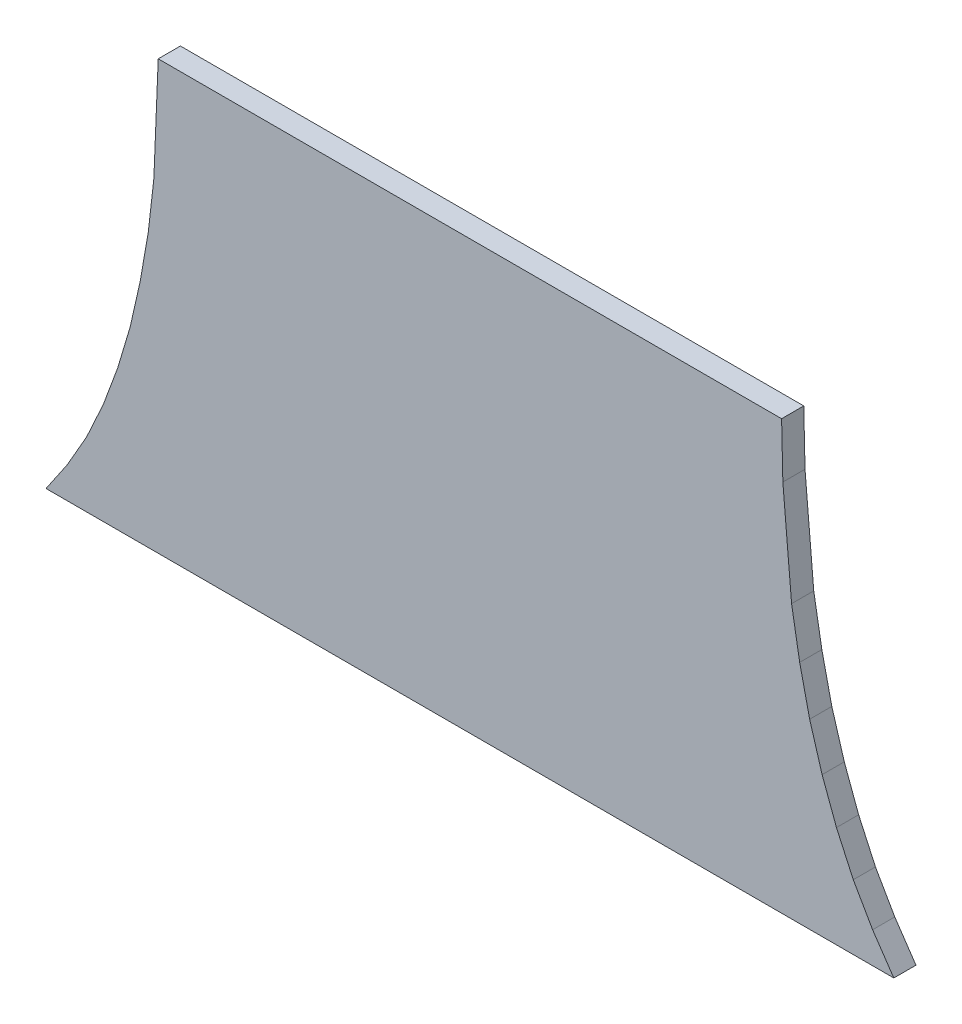
ISO-10303-21;
HEADER;
FILE_DESCRIPTION(('STEP AP214'),'2;1');
FILE_NAME('part.step','',(''),(''),'','','');
FILE_SCHEMA(('AUTOMOTIVE_DESIGN { 1 0 10303 214 1 1 1 1 }'));
ENDSEC;
DATA;
#1=APPLICATION_CONTEXT('core data for automotive mechanical design processes');
#2=APPLICATION_PROTOCOL_DEFINITION('international standard','automotive_design',2000,#1);
#3=PRODUCT_CONTEXT('',#1,'mechanical');
#4=PRODUCT('Part','Part','',(#3));
#5=PRODUCT_RELATED_PRODUCT_CATEGORY('part','',(#4));
#6=PRODUCT_DEFINITION_FORMATION('','',#4);
#7=PRODUCT_DEFINITION_CONTEXT('part definition',#1,'design');
#8=PRODUCT_DEFINITION('design','',#6,#7);
#9=PRODUCT_DEFINITION_SHAPE('','',#8);
#10=(LENGTH_UNIT() NAMED_UNIT(*) SI_UNIT(.MILLI.,.METRE.));
#11=(NAMED_UNIT(*) PLANE_ANGLE_UNIT() SI_UNIT($,.RADIAN.));
#12=(NAMED_UNIT(*) SI_UNIT($,.STERADIAN.) SOLID_ANGLE_UNIT());
#13=UNCERTAINTY_MEASURE_WITH_UNIT(LENGTH_MEASURE(1.E-05),#10,'distance_accuracy_value','');
#14=(GEOMETRIC_REPRESENTATION_CONTEXT(3) GLOBAL_UNCERTAINTY_ASSIGNED_CONTEXT((#13)) GLOBAL_UNIT_ASSIGNED_CONTEXT((#10,
#11,#12)) REPRESENTATION_CONTEXT('',''));
#15=CARTESIAN_POINT('',(0.,0.,0.));
#16=DIRECTION('',(0.,0.,1.));
#17=DIRECTION('',(1.,0.,0.));
#18=AXIS2_PLACEMENT_3D('',#15,#16,#17);
#19=CARTESIAN_POINT('',(56.9199981689453,76.4970016479492,0.));
#20=DIRECTION('',(0.999153314793482,-0.0411418708519441,0.));
#21=DIRECTION('',(-0.0411418708519441,-0.999153314793482,0.));
#22=AXIS2_PLACEMENT_3D('',#19,#20,#21);
#23=PLANE('',#22);
#24=DIRECTION('',(-0.0411418708519441,-0.999153314793481,0.));
#25=VECTOR('',#24,1.);
#26=CARTESIAN_POINT('',(56.9199981689453,76.4970016479492,0.03556));
#27=LINE('',#26,#25);
#28=CARTESIAN_POINT('',(56.9199981689453,76.4970016479492,0.03556));
#29=VERTEX_POINT('',#28);
#30=CARTESIAN_POINT('',(56.9129981994629,76.3270034790039,0.03556));
#31=VERTEX_POINT('',#30);
#32=EDGE_CURVE('E11',#29,#31,#27,.T.);
#33=ORIENTED_EDGE('',*,*,#32,.F.);
#34=DIRECTION('',(0.,0.,1.));
#35=VECTOR('',#34,1.);
#36=CARTESIAN_POINT('',(56.9199981689453,76.4970016479492,0.));
#37=LINE('',#36,#35);
#38=CARTESIAN_POINT('',(56.9199981689453,76.4970016479492,0.));
#39=VERTEX_POINT('',#38);
#40=EDGE_CURVE('E24',#39,#29,#37,.T.);
#41=ORIENTED_EDGE('',*,*,#40,.F.);
#42=DIRECTION('',(-0.0411418708519441,-0.999153314793481,0.));
#43=VECTOR('',#42,1.);
#44=CARTESIAN_POINT('',(56.9199981689453,76.4970016479492,0.));
#45=LINE('',#44,#43);
#46=CARTESIAN_POINT('',(56.9129981994629,76.3270034790039,0.));
#47=VERTEX_POINT('',#46);
#48=EDGE_CURVE('E172',#39,#47,#45,.T.);
#49=ORIENTED_EDGE('',*,*,#48,.T.);
#50=DIRECTION('',(0.,0.,1.));
#51=VECTOR('',#50,1.);
#52=CARTESIAN_POINT('',(56.9129981994629,76.3270034790039,0.));
#53=LINE('',#52,#51);
#54=EDGE_CURVE('E37',#47,#31,#53,.T.);
#55=ORIENTED_EDGE('',*,*,#54,.T.);
#56=EDGE_LOOP('',(#33,#41,#49,#55));
#57=FACE_BOUND('',#56,.T.);
#58=ADVANCED_FACE('F17',(#57),#23,.F.);
#59=CARTESIAN_POINT('',(56.9129981994629,76.3270034790039,0.));
#60=DIRECTION('',(0.993575127705011,-0.113174491852058,0.));
#61=DIRECTION('',(-0.113174491852058,-0.993575127705011,0.));
#62=AXIS2_PLACEMENT_3D('',#59,#60,#61);
#63=PLANE('',#62);
#64=DIRECTION('',(-0.113174491852058,-0.993575127705011,0.));
#65=VECTOR('',#64,1.);
#66=CARTESIAN_POINT('',(56.9129981994629,76.3270034790039,0.03556));
#67=LINE('',#66,#65);
#68=CARTESIAN_POINT('',(56.9039993286133,76.2480010986328,0.03556));
#69=VERTEX_POINT('',#68);
#70=EDGE_CURVE('E308',#31,#69,#67,.T.);
#71=ORIENTED_EDGE('',*,*,#70,.F.);
#72=ORIENTED_EDGE('',*,*,#54,.F.);
#73=DIRECTION('',(-0.113174491852058,-0.993575127705011,0.));
#74=VECTOR('',#73,1.);
#75=CARTESIAN_POINT('',(56.9129981994629,76.3270034790039,0.));
#76=LINE('',#75,#74);
#77=CARTESIAN_POINT('',(56.9039993286133,76.2480010986328,0.));
#78=VERTEX_POINT('',#77);
#79=EDGE_CURVE('E305',#47,#78,#76,.T.);
#80=ORIENTED_EDGE('',*,*,#79,.T.);
#81=DIRECTION('',(0.,0.,1.));
#82=VECTOR('',#81,1.);
#83=CARTESIAN_POINT('',(56.9039993286133,76.2480010986328,0.));
#84=LINE('',#83,#82);
#85=EDGE_CURVE('E303',#78,#69,#84,.T.);
#86=ORIENTED_EDGE('',*,*,#85,.T.);
#87=EDGE_LOOP('',(#71,#72,#80,#86));
#88=FACE_BOUND('',#87,.T.);
#89=ADVANCED_FACE('F316',(#88),#63,.F.);
#90=CARTESIAN_POINT('',(56.9039993286133,76.2480010986328,0.));
#91=DIRECTION('',(0.98530869501432,-0.170782831482494,0.));
#92=DIRECTION('',(-0.170782831482494,-0.98530869501432,0.));
#93=AXIS2_PLACEMENT_3D('',#90,#91,#92);
#94=PLANE('',#93);
#95=DIRECTION('',(-0.170782831482494,-0.98530869501432,0.));
#96=VECTOR('',#95,1.);
#97=CARTESIAN_POINT('',(56.9039993286133,76.2480010986328,0.03556));
#98=LINE('',#97,#96);
#99=CARTESIAN_POINT('',(56.890998840332,76.1729965209961,0.03556));
#100=VERTEX_POINT('',#99);
#101=EDGE_CURVE('E300',#69,#100,#98,.T.);
#102=ORIENTED_EDGE('',*,*,#101,.F.);
#103=ORIENTED_EDGE('',*,*,#85,.F.);
#104=DIRECTION('',(-0.170782831482494,-0.98530869501432,0.));
#105=VECTOR('',#104,1.);
#106=CARTESIAN_POINT('',(56.9039993286133,76.2480010986328,0.));
#107=LINE('',#106,#105);
#108=CARTESIAN_POINT('',(56.890998840332,76.1729965209961,0.));
#109=VERTEX_POINT('',#108);
#110=EDGE_CURVE('E297',#78,#109,#107,.T.);
#111=ORIENTED_EDGE('',*,*,#110,.T.);
#112=DIRECTION('',(0.,0.,1.));
#113=VECTOR('',#112,1.);
#114=CARTESIAN_POINT('',(56.890998840332,76.1729965209961,0.));
#115=LINE('',#114,#113);
#116=EDGE_CURVE('E295',#109,#100,#115,.T.);
#117=ORIENTED_EDGE('',*,*,#116,.T.);
#118=EDGE_LOOP('',(#102,#103,#111,#117));
#119=FACE_BOUND('',#118,.T.);
#120=ADVANCED_FACE('F322',(#119),#94,.F.);
#121=CARTESIAN_POINT('',(56.890998840332,76.1729965209961,0.));
#122=DIRECTION('',(0.975538987966482,-0.219826483748733,0.));
#123=DIRECTION('',(-0.219826483748733,-0.975538987966482,0.));
#124=AXIS2_PLACEMENT_3D('',#121,#122,#123);
#125=PLANE('',#124);
#126=DIRECTION('',(-0.219826483748733,-0.975538987966482,0.));
#127=VECTOR('',#126,1.);
#128=CARTESIAN_POINT('',(56.890998840332,76.1729965209961,0.03556));
#129=LINE('',#128,#127);
#130=CARTESIAN_POINT('',(56.875,76.1019973754883,0.03556));
#131=VERTEX_POINT('',#130);
#132=EDGE_CURVE('E292',#100,#131,#129,.T.);
#133=ORIENTED_EDGE('',*,*,#132,.F.);
#134=ORIENTED_EDGE('',*,*,#116,.F.);
#135=DIRECTION('',(-0.219826483748733,-0.975538987966482,0.));
#136=VECTOR('',#135,1.);
#137=CARTESIAN_POINT('',(56.890998840332,76.1729965209961,0.));
#138=LINE('',#137,#136);
#139=CARTESIAN_POINT('',(56.875,76.1019973754883,0.));
#140=VERTEX_POINT('',#139);
#141=EDGE_CURVE('E289',#109,#140,#138,.T.);
#142=ORIENTED_EDGE('',*,*,#141,.T.);
#143=DIRECTION('',(0.,0.,1.));
#144=VECTOR('',#143,1.);
#145=CARTESIAN_POINT('',(56.875,76.1019973754883,0.));
#146=LINE('',#145,#144);
#147=EDGE_CURVE('E287',#140,#131,#146,.T.);
#148=ORIENTED_EDGE('',*,*,#147,.T.);
#149=EDGE_LOOP('',(#133,#134,#142,#148));
#150=FACE_BOUND('',#149,.T.);
#151=ADVANCED_FACE('F324',(#150),#125,.F.);
#152=CARTESIAN_POINT('',(56.875,76.1019973754883,0.));
#153=DIRECTION('',(0.958209861659622,-0.286066182933686,0.));
#154=DIRECTION('',(-0.286066182933686,-0.958209861659622,0.));
#155=AXIS2_PLACEMENT_3D('',#152,#153,#154);
#156=PLANE('',#155);
#157=DIRECTION('',(-0.286066182933686,-0.958209861659622,0.));
#158=VECTOR('',#157,1.);
#159=CARTESIAN_POINT('',(56.875,76.1019973754883,0.03556));
#160=LINE('',#159,#158);
#161=CARTESIAN_POINT('',(56.8549995422363,76.0350036621094,0.03556));
#162=VERTEX_POINT('',#161);
#163=EDGE_CURVE('E284',#131,#162,#160,.T.);
#164=ORIENTED_EDGE('',*,*,#163,.F.);
#165=ORIENTED_EDGE('',*,*,#147,.F.);
#166=DIRECTION('',(-0.286066182933686,-0.958209861659622,0.));
#167=VECTOR('',#166,1.);
#168=CARTESIAN_POINT('',(56.875,76.1019973754883,0.));
#169=LINE('',#168,#167);
#170=CARTESIAN_POINT('',(56.8549995422363,76.0350036621094,0.));
#171=VERTEX_POINT('',#170);
#172=EDGE_CURVE('E281',#140,#171,#169,.T.);
#173=ORIENTED_EDGE('',*,*,#172,.T.);
#174=DIRECTION('',(0.,0.,1.));
#175=VECTOR('',#174,1.);
#176=CARTESIAN_POINT('',(56.8549995422363,76.0350036621094,0.));
#177=LINE('',#176,#175);
#178=EDGE_CURVE('E279',#171,#162,#177,.T.);
#179=ORIENTED_EDGE('',*,*,#178,.T.);
#180=EDGE_LOOP('',(#164,#165,#173,#179));
#181=FACE_BOUND('',#180,.T.);
#182=ADVANCED_FACE('F329',(#181),#156,.F.);
#183=CARTESIAN_POINT('',(56.8549995422363,76.0350036621094,0.));
#184=DIRECTION('',(0.937579566724935,-0.347770838426519,0.));
#185=DIRECTION('',(-0.347770838426519,-0.937579566724935,0.));
#186=AXIS2_PLACEMENT_3D('',#183,#184,#185);
#187=PLANE('',#186);
#188=DIRECTION('',(-0.347770838426519,-0.937579566724935,0.));
#189=VECTOR('',#188,1.);
#190=CARTESIAN_POINT('',(56.8549995422363,76.0350036621094,0.03556));
#191=LINE('',#190,#189);
#192=CARTESIAN_POINT('',(56.8320007324219,75.9729995727539,0.03556));
#193=VERTEX_POINT('',#192);
#194=EDGE_CURVE('E276',#162,#193,#191,.T.);
#195=ORIENTED_EDGE('',*,*,#194,.F.);
#196=ORIENTED_EDGE('',*,*,#178,.F.);
#197=DIRECTION('',(-0.347770838426519,-0.937579566724935,0.));
#198=VECTOR('',#197,1.);
#199=CARTESIAN_POINT('',(56.8549995422363,76.0350036621094,0.));
#200=LINE('',#199,#198);
#201=CARTESIAN_POINT('',(56.8320007324219,75.9729995727539,0.));
#202=VERTEX_POINT('',#201);
#203=EDGE_CURVE('E273',#171,#202,#200,.T.);
#204=ORIENTED_EDGE('',*,*,#203,.T.);
#205=DIRECTION('',(0.,0.,1.));
#206=VECTOR('',#205,1.);
#207=CARTESIAN_POINT('',(56.8320007324219,75.9729995727539,0.));
#208=LINE('',#207,#206);
#209=EDGE_CURVE('E271',#202,#193,#208,.T.);
#210=ORIENTED_EDGE('',*,*,#209,.T.);
#211=EDGE_LOOP('',(#195,#196,#204,#210));
#212=FACE_BOUND('',#211,.T.);
#213=ADVANCED_FACE('F332',(#212),#187,.F.);
#214=CARTESIAN_POINT('',(56.8320007324219,75.9729995727539,0.));
#215=DIRECTION('',(0.909300357598648,-0.416140432631788,0.));
#216=DIRECTION('',(-0.416140432631788,-0.909300357598648,0.));
#217=AXIS2_PLACEMENT_3D('',#214,#215,#216);
#218=PLANE('',#217);
#219=DIRECTION('',(-0.416140432631788,-0.909300357598648,0.));
#220=VECTOR('',#219,1.);
#221=CARTESIAN_POINT('',(56.8320007324219,75.9729995727539,0.03556));
#222=LINE('',#221,#220);
#223=CARTESIAN_POINT('',(56.8050003051758,75.9140014648438,0.03556));
#224=VERTEX_POINT('',#223);
#225=EDGE_CURVE('E268',#193,#224,#222,.T.);
#226=ORIENTED_EDGE('',*,*,#225,.F.);
#227=ORIENTED_EDGE('',*,*,#209,.F.);
#228=DIRECTION('',(-0.416140432631788,-0.909300357598648,0.));
#229=VECTOR('',#228,1.);
#230=CARTESIAN_POINT('',(56.8320007324219,75.9729995727539,0.));
#231=LINE('',#230,#229);
#232=CARTESIAN_POINT('',(56.8050003051758,75.9140014648438,0.));
#233=VERTEX_POINT('',#232);
#234=EDGE_CURVE('E265',#202,#233,#231,.T.);
#235=ORIENTED_EDGE('',*,*,#234,.T.);
#236=DIRECTION('',(0.,0.,1.));
#237=VECTOR('',#236,1.);
#238=CARTESIAN_POINT('',(56.8050003051758,75.9140014648438,0.));
#239=LINE('',#238,#237);
#240=EDGE_CURVE('E263',#233,#224,#239,.T.);
#241=ORIENTED_EDGE('',*,*,#240,.T.);
#242=EDGE_LOOP('',(#226,#227,#235,#241));
#243=FACE_BOUND('',#242,.T.);
#244=ADVANCED_FACE('F337',(#243),#218,.F.);
#245=CARTESIAN_POINT('',(56.8050003051758,75.9140014648438,0.));
#246=DIRECTION('',(0.86724231986491,-0.497886290869039,0.));
#247=DIRECTION('',(-0.497886290869039,-0.86724231986491,0.));
#248=AXIS2_PLACEMENT_3D('',#245,#246,#247);
#249=PLANE('',#248);
#250=DIRECTION('',(-0.497886290869039,-0.86724231986491,0.));
#251=VECTOR('',#250,1.);
#252=CARTESIAN_POINT('',(56.8050003051758,75.9140014648438,0.03556));
#253=LINE('',#252,#251);
#254=CARTESIAN_POINT('',(56.7739982604981,75.8600006103516,0.03556));
#255=VERTEX_POINT('',#254);
#256=EDGE_CURVE('E260',#224,#255,#253,.T.);
#257=ORIENTED_EDGE('',*,*,#256,.F.);
#258=ORIENTED_EDGE('',*,*,#240,.F.);
#259=DIRECTION('',(-0.497886290869039,-0.86724231986491,0.));
#260=VECTOR('',#259,1.);
#261=CARTESIAN_POINT('',(56.8050003051758,75.9140014648438,0.));
#262=LINE('',#261,#260);
#263=CARTESIAN_POINT('',(56.7739982604981,75.8600006103516,0.));
#264=VERTEX_POINT('',#263);
#265=EDGE_CURVE('E257',#233,#264,#262,.T.);
#266=ORIENTED_EDGE('',*,*,#265,.T.);
#267=DIRECTION('',(0.,0.,1.));
#268=VECTOR('',#267,1.);
#269=CARTESIAN_POINT('',(56.7739982604981,75.8600006103516,0.));
#270=LINE('',#269,#268);
#271=EDGE_CURVE('E255',#264,#255,#270,.T.);
#272=ORIENTED_EDGE('',*,*,#271,.T.);
#273=EDGE_LOOP('',(#257,#258,#266,#272));
#274=FACE_BOUND('',#273,.T.);
#275=ADVANCED_FACE('F340',(#274),#249,.F.);
#276=CARTESIAN_POINT('',(56.7739982604981,75.8600006103516,0.));
#277=DIRECTION('',(0.826968743041032,-0.562247897313219,0.));
#278=DIRECTION('',(-0.562247897313219,-0.826968743041032,0.));
#279=AXIS2_PLACEMENT_3D('',#276,#277,#278);
#280=PLANE('',#279);
#281=DIRECTION('',(-0.562247897313219,-0.826968743041032,0.));
#282=VECTOR('',#281,1.);
#283=CARTESIAN_POINT('',(56.7739982604981,75.8600006103516,0.03556));
#284=LINE('',#283,#282);
#285=CARTESIAN_POINT('',(56.7400016784668,75.8099975585938,0.03556));
#286=VERTEX_POINT('',#285);
#287=EDGE_CURVE('E252',#255,#286,#284,.T.);
#288=ORIENTED_EDGE('',*,*,#287,.F.);
#289=ORIENTED_EDGE('',*,*,#271,.F.);
#290=DIRECTION('',(-0.562247897313219,-0.826968743041032,0.));
#291=VECTOR('',#290,1.);
#292=CARTESIAN_POINT('',(56.7739982604981,75.8600006103516,0.));
#293=LINE('',#292,#291);
#294=CARTESIAN_POINT('',(56.7400016784668,75.8099975585938,0.));
#295=VERTEX_POINT('',#294);
#296=EDGE_CURVE('E249',#264,#295,#293,.T.);
#297=ORIENTED_EDGE('',*,*,#296,.T.);
#298=DIRECTION('',(0.,0.,1.));
#299=VECTOR('',#298,1.);
#300=CARTESIAN_POINT('',(56.7400016784668,75.8099975585938,0.));
#301=LINE('',#300,#299);
#302=EDGE_CURVE('E247',#295,#286,#301,.T.);
#303=ORIENTED_EDGE('',*,*,#302,.T.);
#304=EDGE_LOOP('',(#288,#289,#297,#303));
#305=FACE_BOUND('',#304,.T.);
#306=ADVANCED_FACE('F345',(#305),#280,.F.);
#307=CARTESIAN_POINT('',(56.7400016784668,75.8099975585938,0.));
#308=DIRECTION('',(0.,1.,0.));
#309=DIRECTION('',(1.,0.,0.));
#310=AXIS2_PLACEMENT_3D('',#307,#308,#309);
#311=PLANE('',#310);
#312=DIRECTION('',(1.,0.,0.));
#313=VECTOR('',#312,1.);
#314=CARTESIAN_POINT('',(56.7400016784668,75.8099975585938,0.03556));
#315=LINE('',#314,#313);
#316=CARTESIAN_POINT('',(58.0999984741211,75.8099975585938,0.03556));
#317=VERTEX_POINT('',#316);
#318=EDGE_CURVE('E244',#286,#317,#315,.T.);
#319=ORIENTED_EDGE('',*,*,#318,.F.);
#320=ORIENTED_EDGE('',*,*,#302,.F.);
#321=DIRECTION('',(1.,0.,0.));
#322=VECTOR('',#321,1.);
#323=CARTESIAN_POINT('',(56.7400016784668,75.8099975585938,0.));
#324=LINE('',#323,#322);
#325=CARTESIAN_POINT('',(58.0999984741211,75.8099975585938,0.));
#326=VERTEX_POINT('',#325);
#327=EDGE_CURVE('E241',#295,#326,#324,.T.);
#328=ORIENTED_EDGE('',*,*,#327,.T.);
#329=DIRECTION('',(0.,0.,1.));
#330=VECTOR('',#329,1.);
#331=CARTESIAN_POINT('',(58.0999984741211,75.8099975585938,0.));
#332=LINE('',#331,#330);
#333=EDGE_CURVE('E239',#326,#317,#332,.T.);
#334=ORIENTED_EDGE('',*,*,#333,.T.);
#335=EDGE_LOOP('',(#319,#320,#328,#334));
#336=FACE_BOUND('',#335,.T.);
#337=ADVANCED_FACE('F348',(#336),#311,.F.);
#338=CARTESIAN_POINT('',(58.0999984741211,75.8099975585938,0.));
#339=DIRECTION('',(-0.826968743041032,-0.562247897313219,0.));
#340=DIRECTION('',(-0.562247897313219,0.826968743041032,0.));
#341=AXIS2_PLACEMENT_3D('',#338,#339,#340);
#342=PLANE('',#341);
#343=DIRECTION('',(-0.562247897313219,0.826968743041032,0.));
#344=VECTOR('',#343,1.);
#345=CARTESIAN_POINT('',(58.0999984741211,75.8099975585938,0.03556));
#346=LINE('',#345,#344);
#347=CARTESIAN_POINT('',(58.0660018920899,75.8600006103516,0.03556));
#348=VERTEX_POINT('',#347);
#349=EDGE_CURVE('E236',#317,#348,#346,.T.);
#350=ORIENTED_EDGE('',*,*,#349,.F.);
#351=ORIENTED_EDGE('',*,*,#333,.F.);
#352=DIRECTION('',(-0.562247897313219,0.826968743041032,0.));
#353=VECTOR('',#352,1.);
#354=CARTESIAN_POINT('',(58.0999984741211,75.8099975585938,0.));
#355=LINE('',#354,#353);
#356=CARTESIAN_POINT('',(58.0660018920899,75.8600006103516,0.));
#357=VERTEX_POINT('',#356);
#358=EDGE_CURVE('E233',#326,#357,#355,.T.);
#359=ORIENTED_EDGE('',*,*,#358,.T.);
#360=DIRECTION('',(0.,0.,1.));
#361=VECTOR('',#360,1.);
#362=CARTESIAN_POINT('',(58.0660018920899,75.8600006103516,0.));
#363=LINE('',#362,#361);
#364=EDGE_CURVE('E231',#357,#348,#363,.T.);
#365=ORIENTED_EDGE('',*,*,#364,.T.);
#366=EDGE_LOOP('',(#350,#351,#359,#365));
#367=FACE_BOUND('',#366,.T.);
#368=ADVANCED_FACE('F353',(#367),#342,.F.);
#369=CARTESIAN_POINT('',(58.0660018920899,75.8600006103516,0.));
#370=DIRECTION('',(-0.86724231986491,-0.497886290869039,0.));
#371=DIRECTION('',(-0.497886290869039,0.86724231986491,0.));
#372=AXIS2_PLACEMENT_3D('',#369,#370,#371);
#373=PLANE('',#372);
#374=DIRECTION('',(-0.497886290869039,0.86724231986491,0.));
#375=VECTOR('',#374,1.);
#376=CARTESIAN_POINT('',(58.0660018920899,75.8600006103516,0.03556));
#377=LINE('',#376,#375);
#378=CARTESIAN_POINT('',(58.0349998474121,75.9140014648438,0.03556));
#379=VERTEX_POINT('',#378);
#380=EDGE_CURVE('E228',#348,#379,#377,.T.);
#381=ORIENTED_EDGE('',*,*,#380,.F.);
#382=ORIENTED_EDGE('',*,*,#364,.F.);
#383=DIRECTION('',(-0.497886290869039,0.86724231986491,0.));
#384=VECTOR('',#383,1.);
#385=CARTESIAN_POINT('',(58.0660018920899,75.8600006103516,0.));
#386=LINE('',#385,#384);
#387=CARTESIAN_POINT('',(58.0349998474121,75.9140014648438,0.));
#388=VERTEX_POINT('',#387);
#389=EDGE_CURVE('E225',#357,#388,#386,.T.);
#390=ORIENTED_EDGE('',*,*,#389,.T.);
#391=DIRECTION('',(0.,0.,1.));
#392=VECTOR('',#391,1.);
#393=CARTESIAN_POINT('',(58.0349998474121,75.9140014648438,0.));
#394=LINE('',#393,#392);
#395=EDGE_CURVE('E223',#388,#379,#394,.T.);
#396=ORIENTED_EDGE('',*,*,#395,.T.);
#397=EDGE_LOOP('',(#381,#382,#390,#396));
#398=FACE_BOUND('',#397,.T.);
#399=ADVANCED_FACE('F356',(#398),#373,.F.);
#400=CARTESIAN_POINT('',(58.0349998474121,75.9140014648438,0.));
#401=DIRECTION('',(-0.909300357598648,-0.416140432631788,0.));
#402=DIRECTION('',(-0.416140432631788,0.909300357598648,0.));
#403=AXIS2_PLACEMENT_3D('',#400,#401,#402);
#404=PLANE('',#403);
#405=DIRECTION('',(-0.416140432631788,0.909300357598648,0.));
#406=VECTOR('',#405,1.);
#407=CARTESIAN_POINT('',(58.0349998474121,75.9140014648438,0.03556));
#408=LINE('',#407,#406);
#409=CARTESIAN_POINT('',(58.007999420166,75.9729995727539,0.03556));
#410=VERTEX_POINT('',#409);
#411=EDGE_CURVE('E220',#379,#410,#408,.T.);
#412=ORIENTED_EDGE('',*,*,#411,.F.);
#413=ORIENTED_EDGE('',*,*,#395,.F.);
#414=DIRECTION('',(-0.416140432631788,0.909300357598648,0.));
#415=VECTOR('',#414,1.);
#416=CARTESIAN_POINT('',(58.0349998474121,75.9140014648438,0.));
#417=LINE('',#416,#415);
#418=CARTESIAN_POINT('',(58.007999420166,75.9729995727539,0.));
#419=VERTEX_POINT('',#418);
#420=EDGE_CURVE('E217',#388,#419,#417,.T.);
#421=ORIENTED_EDGE('',*,*,#420,.T.);
#422=DIRECTION('',(0.,0.,1.));
#423=VECTOR('',#422,1.);
#424=CARTESIAN_POINT('',(58.007999420166,75.9729995727539,0.));
#425=LINE('',#424,#423);
#426=EDGE_CURVE('E215',#419,#410,#425,.T.);
#427=ORIENTED_EDGE('',*,*,#426,.T.);
#428=EDGE_LOOP('',(#412,#413,#421,#427));
#429=FACE_BOUND('',#428,.T.);
#430=ADVANCED_FACE('F361',(#429),#404,.F.);
#431=CARTESIAN_POINT('',(58.007999420166,75.9729995727539,0.));
#432=DIRECTION('',(-0.937579566724935,-0.347770838426519,0.));
#433=DIRECTION('',(-0.347770838426519,0.937579566724935,0.));
#434=AXIS2_PLACEMENT_3D('',#431,#432,#433);
#435=PLANE('',#434);
#436=DIRECTION('',(-0.347770838426519,0.937579566724935,0.));
#437=VECTOR('',#436,1.);
#438=CARTESIAN_POINT('',(58.007999420166,75.9729995727539,0.03556));
#439=LINE('',#438,#437);
#440=CARTESIAN_POINT('',(57.9850006103516,76.0350036621094,0.03556));
#441=VERTEX_POINT('',#440);
#442=EDGE_CURVE('E212',#410,#441,#439,.T.);
#443=ORIENTED_EDGE('',*,*,#442,.F.);
#444=ORIENTED_EDGE('',*,*,#426,.F.);
#445=DIRECTION('',(-0.347770838426519,0.937579566724935,0.));
#446=VECTOR('',#445,1.);
#447=CARTESIAN_POINT('',(58.007999420166,75.9729995727539,0.));
#448=LINE('',#447,#446);
#449=CARTESIAN_POINT('',(57.9850006103516,76.0350036621094,0.));
#450=VERTEX_POINT('',#449);
#451=EDGE_CURVE('E209',#419,#450,#448,.T.);
#452=ORIENTED_EDGE('',*,*,#451,.T.);
#453=DIRECTION('',(0.,0.,1.));
#454=VECTOR('',#453,1.);
#455=CARTESIAN_POINT('',(57.9850006103516,76.0350036621094,0.));
#456=LINE('',#455,#454);
#457=EDGE_CURVE('E207',#450,#441,#456,.T.);
#458=ORIENTED_EDGE('',*,*,#457,.T.);
#459=EDGE_LOOP('',(#443,#444,#452,#458));
#460=FACE_BOUND('',#459,.T.);
#461=ADVANCED_FACE('F364',(#460),#435,.F.);
#462=CARTESIAN_POINT('',(57.9850006103516,76.0350036621094,0.));
#463=DIRECTION('',(-0.958209861659622,-0.286066182933686,0.));
#464=DIRECTION('',(-0.286066182933686,0.958209861659622,0.));
#465=AXIS2_PLACEMENT_3D('',#462,#463,#464);
#466=PLANE('',#465);
#467=DIRECTION('',(-0.286066182933686,0.958209861659622,0.));
#468=VECTOR('',#467,1.);
#469=CARTESIAN_POINT('',(57.9850006103516,76.0350036621094,0.03556));
#470=LINE('',#469,#468);
#471=CARTESIAN_POINT('',(57.9650001525879,76.1019973754883,0.03556));
#472=VERTEX_POINT('',#471);
#473=EDGE_CURVE('E204',#441,#472,#470,.T.);
#474=ORIENTED_EDGE('',*,*,#473,.F.);
#475=ORIENTED_EDGE('',*,*,#457,.F.);
#476=DIRECTION('',(-0.286066182933686,0.958209861659622,0.));
#477=VECTOR('',#476,1.);
#478=CARTESIAN_POINT('',(57.9850006103516,76.0350036621094,0.));
#479=LINE('',#478,#477);
#480=CARTESIAN_POINT('',(57.9650001525879,76.1019973754883,0.));
#481=VERTEX_POINT('',#480);
#482=EDGE_CURVE('E201',#450,#481,#479,.T.);
#483=ORIENTED_EDGE('',*,*,#482,.T.);
#484=DIRECTION('',(0.,0.,1.));
#485=VECTOR('',#484,1.);
#486=CARTESIAN_POINT('',(57.9650001525879,76.1019973754883,0.));
#487=LINE('',#486,#485);
#488=EDGE_CURVE('E199',#481,#472,#487,.T.);
#489=ORIENTED_EDGE('',*,*,#488,.T.);
#490=EDGE_LOOP('',(#474,#475,#483,#489));
#491=FACE_BOUND('',#490,.T.);
#492=ADVANCED_FACE('F369',(#491),#466,.F.);
#493=CARTESIAN_POINT('',(57.9650001525879,76.1019973754883,0.));
#494=DIRECTION('',(-0.975538987966482,-0.219826483748733,0.));
#495=DIRECTION('',(-0.219826483748733,0.975538987966482,0.));
#496=AXIS2_PLACEMENT_3D('',#493,#494,#495);
#497=PLANE('',#496);
#498=DIRECTION('',(-0.219826483748733,0.975538987966482,0.));
#499=VECTOR('',#498,1.);
#500=CARTESIAN_POINT('',(57.9650001525879,76.1019973754883,0.03556));
#501=LINE('',#500,#499);
#502=CARTESIAN_POINT('',(57.9490013122559,76.1729965209961,0.03556));
#503=VERTEX_POINT('',#502);
#504=EDGE_CURVE('E196',#472,#503,#501,.T.);
#505=ORIENTED_EDGE('',*,*,#504,.F.);
#506=ORIENTED_EDGE('',*,*,#488,.F.);
#507=DIRECTION('',(-0.219826483748733,0.975538987966482,0.));
#508=VECTOR('',#507,1.);
#509=CARTESIAN_POINT('',(57.9650001525879,76.1019973754883,0.));
#510=LINE('',#509,#508);
#511=CARTESIAN_POINT('',(57.9490013122559,76.1729965209961,0.));
#512=VERTEX_POINT('',#511);
#513=EDGE_CURVE('E193',#481,#512,#510,.T.);
#514=ORIENTED_EDGE('',*,*,#513,.T.);
#515=DIRECTION('',(0.,0.,1.));
#516=VECTOR('',#515,1.);
#517=CARTESIAN_POINT('',(57.9490013122559,76.1729965209961,0.));
#518=LINE('',#517,#516);
#519=EDGE_CURVE('E191',#512,#503,#518,.T.);
#520=ORIENTED_EDGE('',*,*,#519,.T.);
#521=EDGE_LOOP('',(#505,#506,#514,#520));
#522=FACE_BOUND('',#521,.T.);
#523=ADVANCED_FACE('F372',(#522),#497,.F.);
#524=CARTESIAN_POINT('',(57.9490013122559,76.1729965209961,0.));
#525=DIRECTION('',(-0.98530869501432,-0.170782831482494,0.));
#526=DIRECTION('',(-0.170782831482494,0.98530869501432,0.));
#527=AXIS2_PLACEMENT_3D('',#524,#525,#526);
#528=PLANE('',#527);
#529=DIRECTION('',(-0.170782831482494,0.98530869501432,0.));
#530=VECTOR('',#529,1.);
#531=CARTESIAN_POINT('',(57.9490013122559,76.1729965209961,0.03556));
#532=LINE('',#531,#530);
#533=CARTESIAN_POINT('',(57.9360008239746,76.2480010986328,0.03556));
#534=VERTEX_POINT('',#533);
#535=EDGE_CURVE('E188',#503,#534,#532,.T.);
#536=ORIENTED_EDGE('',*,*,#535,.F.);
#537=ORIENTED_EDGE('',*,*,#519,.F.);
#538=DIRECTION('',(-0.170782831482494,0.98530869501432,0.));
#539=VECTOR('',#538,1.);
#540=CARTESIAN_POINT('',(57.9490013122559,76.1729965209961,0.));
#541=LINE('',#540,#539);
#542=CARTESIAN_POINT('',(57.9360008239746,76.2480010986328,0.));
#543=VERTEX_POINT('',#542);
#544=EDGE_CURVE('E185',#512,#543,#541,.T.);
#545=ORIENTED_EDGE('',*,*,#544,.T.);
#546=DIRECTION('',(0.,0.,1.));
#547=VECTOR('',#546,1.);
#548=CARTESIAN_POINT('',(57.9360008239746,76.2480010986328,0.));
#549=LINE('',#548,#547);
#550=EDGE_CURVE('E183',#543,#534,#549,.T.);
#551=ORIENTED_EDGE('',*,*,#550,.T.);
#552=EDGE_LOOP('',(#536,#537,#545,#551));
#553=FACE_BOUND('',#552,.T.);
#554=ADVANCED_FACE('F377',(#553),#528,.F.);
#555=CARTESIAN_POINT('',(57.9360008239746,76.2480010986328,0.));
#556=DIRECTION('',(-0.996286749097029,-0.0860971171043161,0.));
#557=DIRECTION('',(-0.0860971171043161,0.996286749097029,0.));
#558=AXIS2_PLACEMENT_3D('',#555,#556,#557);
#559=PLANE('',#558);
#560=DIRECTION('',(-0.0860971171043161,0.996286749097029,0.));
#561=VECTOR('',#560,1.);
#562=CARTESIAN_POINT('',(57.9360008239746,76.2480010986328,0.03556));
#563=LINE('',#562,#561);
#564=CARTESIAN_POINT('',(57.9220008850098,76.4100036621094,0.03556));
#565=VERTEX_POINT('',#564);
#566=EDGE_CURVE('E180',#534,#565,#563,.T.);
#567=ORIENTED_EDGE('',*,*,#566,.F.);
#568=ORIENTED_EDGE('',*,*,#550,.F.);
#569=DIRECTION('',(-0.0860971171043161,0.996286749097029,0.));
#570=VECTOR('',#569,1.);
#571=CARTESIAN_POINT('',(57.9360008239746,76.2480010986328,0.));
#572=LINE('',#571,#570);
#573=CARTESIAN_POINT('',(57.9220008850098,76.4100036621094,0.));
#574=VERTEX_POINT('',#573);
#575=EDGE_CURVE('E178',#543,#574,#572,.T.);
#576=ORIENTED_EDGE('',*,*,#575,.T.);
#577=DIRECTION('',(0.,0.,1.));
#578=VECTOR('',#577,1.);
#579=CARTESIAN_POINT('',(57.9220008850098,76.4100036621094,0.));
#580=LINE('',#579,#578);
#581=EDGE_CURVE('E163',#574,#565,#580,.T.);
#582=ORIENTED_EDGE('',*,*,#581,.T.);
#583=EDGE_LOOP('',(#567,#568,#576,#582));
#584=FACE_BOUND('',#583,.T.);
#585=ADVANCED_FACE('F379',(#584),#559,.F.);
#586=CARTESIAN_POINT('',(57.9220008850098,76.4100036621094,0.));
#587=DIRECTION('',(-0.999735139128886,-0.0230141606613464,0.));
#588=DIRECTION('',(-0.0230141606613464,0.999735139128886,0.));
#589=AXIS2_PLACEMENT_3D('',#586,#587,#588);
#590=PLANE('',#589);
#591=DIRECTION('',(-0.0230141606613464,0.999735139128886,0.));
#592=VECTOR('',#591,1.);
#593=CARTESIAN_POINT('',(57.9220008850098,76.4100036621094,0.03556));
#594=LINE('',#593,#592);
#595=CARTESIAN_POINT('',(57.9199981689453,76.4970016479492,0.03556));
#596=VERTEX_POINT('',#595);
#597=EDGE_CURVE('E167',#565,#596,#594,.T.);
#598=ORIENTED_EDGE('',*,*,#597,.F.);
#599=ORIENTED_EDGE('',*,*,#581,.F.);
#600=DIRECTION('',(-0.0230141606613464,0.999735139128886,0.));
#601=VECTOR('',#600,1.);
#602=CARTESIAN_POINT('',(57.9220008850098,76.4100036621094,0.));
#603=LINE('',#602,#601);
#604=CARTESIAN_POINT('',(57.9199981689453,76.4970016479492,0.));
#605=VERTEX_POINT('',#604);
#606=EDGE_CURVE('E159',#574,#605,#603,.T.);
#607=ORIENTED_EDGE('',*,*,#606,.T.);
#608=DIRECTION('',(0.,0.,1.));
#609=VECTOR('',#608,1.);
#610=CARTESIAN_POINT('',(57.9199981689453,76.4970016479492,0.));
#611=LINE('',#610,#609);
#612=EDGE_CURVE('E149',#605,#596,#611,.T.);
#613=ORIENTED_EDGE('',*,*,#612,.T.);
#614=EDGE_LOOP('',(#598,#599,#607,#613));
#615=FACE_BOUND('',#614,.T.);
#616=ADVANCED_FACE('F162',(#615),#590,.F.);
#617=CARTESIAN_POINT('',(57.9199981689453,76.4970016479492,0.));
#618=DIRECTION('',(0.,-1.,0.));
#619=DIRECTION('',(-1.,0.,0.));
#620=AXIS2_PLACEMENT_3D('',#617,#618,#619);
#621=PLANE('',#620);
#622=DIRECTION('',(-1.,0.,0.));
#623=VECTOR('',#622,1.);
#624=CARTESIAN_POINT('',(57.9199981689453,76.4970016479492,0.03556));
#625=LINE('',#624,#623);
#626=EDGE_CURVE('E155',#596,#29,#625,.T.);
#627=ORIENTED_EDGE('',*,*,#626,.F.);
#628=ORIENTED_EDGE('',*,*,#612,.F.);
#629=DIRECTION('',(-1.,0.,0.));
#630=VECTOR('',#629,1.);
#631=CARTESIAN_POINT('',(57.9199981689453,76.4970016479492,0.));
#632=LINE('',#631,#630);
#633=EDGE_CURVE('E153',#605,#39,#632,.T.);
#634=ORIENTED_EDGE('',*,*,#633,.T.);
#635=ORIENTED_EDGE('',*,*,#40,.T.);
#636=EDGE_LOOP('',(#627,#628,#634,#635));
#637=FACE_BOUND('',#636,.T.);
#638=ADVANCED_FACE('F151',(#637),#621,.F.);
#639=CARTESIAN_POINT('',(56.9199981689453,76.4970016479492,0.));
#640=DIRECTION('',(0.,0.,1.));
#641=DIRECTION('',(1.,0.,0.));
#642=AXIS2_PLACEMENT_3D('',#639,#640,#641);
#643=PLANE('',#642);
#644=ORIENTED_EDGE('',*,*,#633,.F.);
#645=ORIENTED_EDGE('',*,*,#606,.F.);
#646=ORIENTED_EDGE('',*,*,#575,.F.);
#647=ORIENTED_EDGE('',*,*,#544,.F.);
#648=ORIENTED_EDGE('',*,*,#513,.F.);
#649=ORIENTED_EDGE('',*,*,#482,.F.);
#650=ORIENTED_EDGE('',*,*,#451,.F.);
#651=ORIENTED_EDGE('',*,*,#420,.F.);
#652=ORIENTED_EDGE('',*,*,#389,.F.);
#653=ORIENTED_EDGE('',*,*,#358,.F.);
#654=ORIENTED_EDGE('',*,*,#327,.F.);
#655=ORIENTED_EDGE('',*,*,#296,.F.);
#656=ORIENTED_EDGE('',*,*,#265,.F.);
#657=ORIENTED_EDGE('',*,*,#234,.F.);
#658=ORIENTED_EDGE('',*,*,#203,.F.);
#659=ORIENTED_EDGE('',*,*,#172,.F.);
#660=ORIENTED_EDGE('',*,*,#141,.F.);
#661=ORIENTED_EDGE('',*,*,#110,.F.);
#662=ORIENTED_EDGE('',*,*,#79,.F.);
#663=ORIENTED_EDGE('',*,*,#48,.F.);
#664=EDGE_LOOP('',(#644,#645,#646,#647,#648,#649,#650,#651,#652,#653,#654,#655,#656,#657,#658,
#659,#660,#661,#662,#663));
#665=FACE_BOUND('',#664,.T.);
#666=ADVANCED_FACE('F170',(#665),#643,.F.);
#667=CARTESIAN_POINT('',(56.9199981689453,76.4970016479492,0.03556));
#668=DIRECTION('',(0.,0.,1.));
#669=DIRECTION('',(1.,0.,0.));
#670=AXIS2_PLACEMENT_3D('',#667,#668,#669);
#671=PLANE('',#670);
#672=ORIENTED_EDGE('',*,*,#32,.T.);
#673=ORIENTED_EDGE('',*,*,#70,.T.);
#674=ORIENTED_EDGE('',*,*,#101,.T.);
#675=ORIENTED_EDGE('',*,*,#132,.T.);
#676=ORIENTED_EDGE('',*,*,#163,.T.);
#677=ORIENTED_EDGE('',*,*,#194,.T.);
#678=ORIENTED_EDGE('',*,*,#225,.T.);
#679=ORIENTED_EDGE('',*,*,#256,.T.);
#680=ORIENTED_EDGE('',*,*,#287,.T.);
#681=ORIENTED_EDGE('',*,*,#318,.T.);
#682=ORIENTED_EDGE('',*,*,#349,.T.);
#683=ORIENTED_EDGE('',*,*,#380,.T.);
#684=ORIENTED_EDGE('',*,*,#411,.T.);
#685=ORIENTED_EDGE('',*,*,#442,.T.);
#686=ORIENTED_EDGE('',*,*,#473,.T.);
#687=ORIENTED_EDGE('',*,*,#504,.T.);
#688=ORIENTED_EDGE('',*,*,#535,.T.);
#689=ORIENTED_EDGE('',*,*,#566,.T.);
#690=ORIENTED_EDGE('',*,*,#597,.T.);
#691=ORIENTED_EDGE('',*,*,#626,.T.);
#692=EDGE_LOOP('',(#672,#673,#674,#675,#676,#677,#678,#679,#680,#681,#682,#683,#684,#685,#686,
#687,#688,#689,#690,#691));
#693=FACE_BOUND('',#692,.T.);
#694=ADVANCED_FACE('F319',(#693),#671,.T.);
#695=CLOSED_SHELL('',(#58,#89,#120,#151,#182,#213,#244,#275,#306,#337,#368,#399,#430,#461,#492,
#523,#554,#585,#616,#638,#666,#694));
#696=MANIFOLD_SOLID_BREP('B1',#695);
#697=ADVANCED_BREP_SHAPE_REPRESENTATION('',(#18,#696),#14);
#698=SHAPE_DEFINITION_REPRESENTATION(#9,#697);
ENDSEC;
END-ISO-10303-21;
